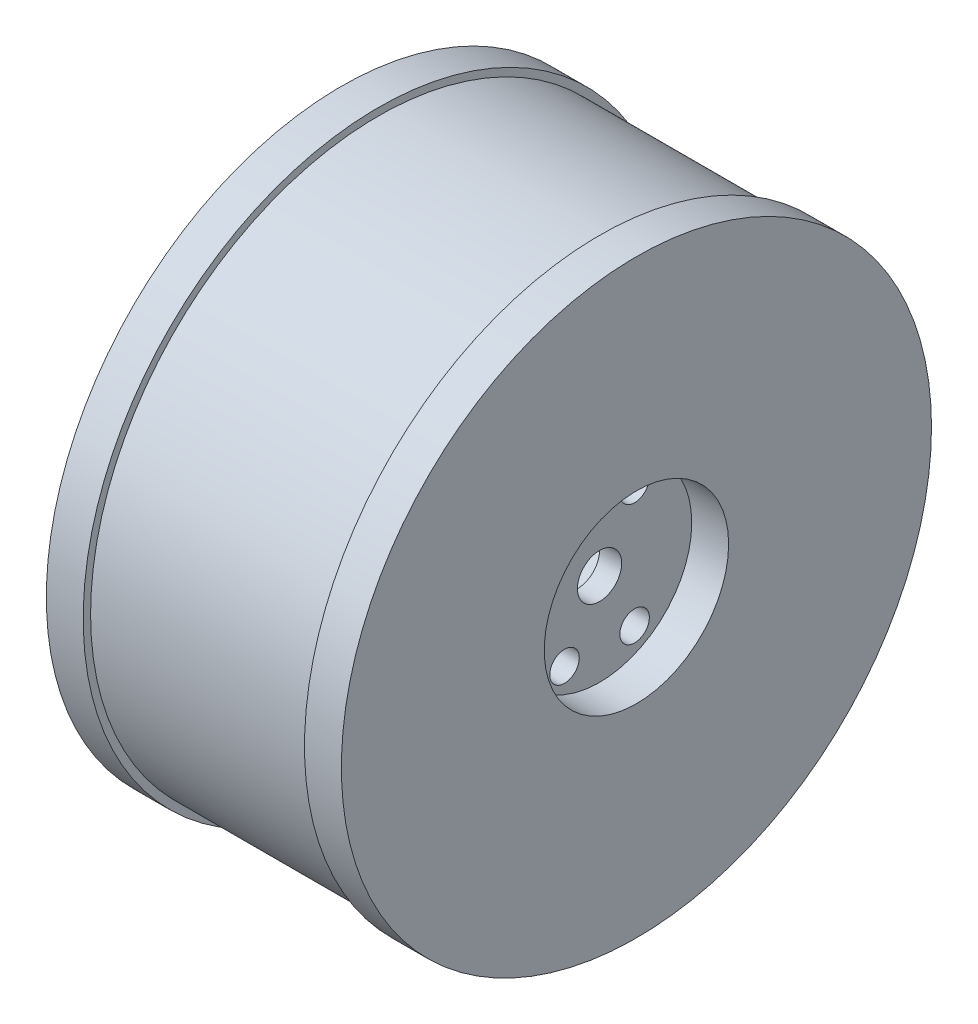
ISO-10303-21;
HEADER;
FILE_DESCRIPTION(('STEP AP214'),'2;1');
FILE_NAME('part.step','',(''),(''),'','','');
FILE_SCHEMA(('AUTOMOTIVE_DESIGN { 1 0 10303 214 1 1 1 1 }'));
ENDSEC;
DATA;
#1=APPLICATION_CONTEXT('core data for automotive mechanical design processes');
#2=APPLICATION_PROTOCOL_DEFINITION('international standard','automotive_design',2000,#1);
#3=PRODUCT_CONTEXT('',#1,'mechanical');
#4=PRODUCT('Part','Part','',(#3));
#5=PRODUCT_RELATED_PRODUCT_CATEGORY('part','',(#4));
#6=PRODUCT_DEFINITION_FORMATION('','',#4);
#7=PRODUCT_DEFINITION_CONTEXT('part definition',#1,'design');
#8=PRODUCT_DEFINITION('design','',#6,#7);
#9=PRODUCT_DEFINITION_SHAPE('','',#8);
#10=(LENGTH_UNIT() NAMED_UNIT(*) SI_UNIT(.MILLI.,.METRE.));
#11=(NAMED_UNIT(*) PLANE_ANGLE_UNIT() SI_UNIT($,.RADIAN.));
#12=(NAMED_UNIT(*) SI_UNIT($,.STERADIAN.) SOLID_ANGLE_UNIT());
#13=UNCERTAINTY_MEASURE_WITH_UNIT(LENGTH_MEASURE(1.E-05),#10,'distance_accuracy_value','');
#14=(GEOMETRIC_REPRESENTATION_CONTEXT(3) GLOBAL_UNCERTAINTY_ASSIGNED_CONTEXT((#13)) GLOBAL_UNIT_ASSIGNED_CONTEXT((#10,
#11,#12)) REPRESENTATION_CONTEXT('',''));
#15=CARTESIAN_POINT('',(0.,0.,0.));
#16=DIRECTION('',(0.,0.,1.));
#17=DIRECTION('',(1.,0.,0.));
#18=AXIS2_PLACEMENT_3D('',#15,#16,#17);
#19=CARTESIAN_POINT('',(-49.6444990272904,0.,0.));
#20=DIRECTION('',(-1.,0.,0.));
#21=DIRECTION('',(0.,0.,-1.));
#22=AXIS2_PLACEMENT_3D('',#19,#20,#21);
#23=CYLINDRICAL_SURFACE('',#22,34.);
#24=CARTESIAN_POINT('',(0.,0.,0.));
#25=DIRECTION('',(1.,0.,0.));
#26=DIRECTION('',(0.,0.,-1.));
#27=AXIS2_PLACEMENT_3D('',#24,#25,#26);
#28=CIRCLE('',#27,34.);
#29=CARTESIAN_POINT('',(0.,0.,-34.));
#30=VERTEX_POINT('',#29);
#31=EDGE_CURVE('E58',#30,#30,#28,.T.);
#32=ORIENTED_EDGE('',*,*,#31,.T.);
#33=EDGE_LOOP('',(#32));
#34=FACE_BOUND('',#33,.T.);
#35=CARTESIAN_POINT('',(-32.,0.,0.));
#36=DIRECTION('',(1.,0.,0.));
#37=DIRECTION('',(0.,0.,-1.));
#38=AXIS2_PLACEMENT_3D('',#35,#36,#37);
#39=CIRCLE('',#38,34.);
#40=CARTESIAN_POINT('',(-32.,0.,-34.));
#41=VERTEX_POINT('',#40);
#42=EDGE_CURVE('E10',#41,#41,#39,.T.);
#43=ORIENTED_EDGE('',*,*,#42,.F.);
#44=EDGE_LOOP('',(#43));
#45=FACE_BOUND('',#44,.T.);
#46=ADVANCED_FACE('F30',(#34,#45),#23,.F.);
#47=CARTESIAN_POINT('',(-32.,34.,0.));
#48=DIRECTION('',(1.,0.,0.));
#49=DIRECTION('',(0.,0.,1.));
#50=AXIS2_PLACEMENT_3D('',#47,#48,#49);
#51=PLANE('',#50);
#52=ORIENTED_EDGE('',*,*,#42,.T.);
#53=EDGE_LOOP('',(#52));
#54=FACE_BOUND('',#53,.T.);
#55=CARTESIAN_POINT('',(-32.,0.,0.));
#56=DIRECTION('',(1.,0.,0.));
#57=DIRECTION('',(0.,0.,-1.));
#58=AXIS2_PLACEMENT_3D('',#55,#56,#57);
#59=CIRCLE('',#58,40.);
#60=CARTESIAN_POINT('',(-32.,0.,-40.));
#61=VERTEX_POINT('',#60);
#62=EDGE_CURVE('E36',#61,#61,#59,.T.);
#63=ORIENTED_EDGE('',*,*,#62,.F.);
#64=EDGE_LOOP('',(#63));
#65=FACE_BOUND('',#64,.T.);
#66=ADVANCED_FACE('F126',(#54,#65),#51,.F.);
#67=CARTESIAN_POINT('',(-49.6444990272904,0.,0.));
#68=DIRECTION('',(-1.,0.,0.));
#69=DIRECTION('',(0.,0.,-1.));
#70=AXIS2_PLACEMENT_3D('',#67,#68,#69);
#71=CYLINDRICAL_SURFACE('',#70,40.);
#72=ORIENTED_EDGE('',*,*,#62,.T.);
#73=EDGE_LOOP('',(#72));
#74=FACE_BOUND('',#73,.T.);
#75=CARTESIAN_POINT('',(-27.,0.,0.));
#76=DIRECTION('',(1.,0.,0.));
#77=DIRECTION('',(0.,0.,-1.));
#78=AXIS2_PLACEMENT_3D('',#75,#76,#77);
#79=CIRCLE('',#78,40.);
#80=CARTESIAN_POINT('',(-27.,0.,-39.9999999999999));
#81=VERTEX_POINT('',#80);
#82=EDGE_CURVE('E40',#81,#81,#79,.T.);
#83=ORIENTED_EDGE('',*,*,#82,.F.);
#84=EDGE_LOOP('',(#83));
#85=FACE_BOUND('',#84,.T.);
#86=ADVANCED_FACE('F130',(#74,#85),#71,.T.);
#87=CARTESIAN_POINT('',(-27.,40.,0.));
#88=DIRECTION('',(-1.,0.,0.));
#89=DIRECTION('',(0.,0.,-1.));
#90=AXIS2_PLACEMENT_3D('',#87,#88,#89);
#91=PLANE('',#90);
#92=ORIENTED_EDGE('',*,*,#82,.T.);
#93=EDGE_LOOP('',(#92));
#94=FACE_BOUND('',#93,.T.);
#95=CARTESIAN_POINT('',(-27.,0.,0.));
#96=DIRECTION('',(1.,0.,0.));
#97=DIRECTION('',(0.,0.,-1.));
#98=AXIS2_PLACEMENT_3D('',#95,#96,#97);
#99=CIRCLE('',#98,39.);
#100=CARTESIAN_POINT('',(-27.,0.,-38.9999999999999));
#101=VERTEX_POINT('',#100);
#102=EDGE_CURVE('E44',#101,#101,#99,.T.);
#103=ORIENTED_EDGE('',*,*,#102,.F.);
#104=EDGE_LOOP('',(#103));
#105=FACE_BOUND('',#104,.T.);
#106=ADVANCED_FACE('F134',(#94,#105),#91,.F.);
#107=CARTESIAN_POINT('',(-49.6444990272904,0.,0.));
#108=DIRECTION('',(-1.,0.,0.));
#109=DIRECTION('',(0.,0.,-1.));
#110=AXIS2_PLACEMENT_3D('',#107,#108,#109);
#111=CYLINDRICAL_SURFACE('',#110,39.);
#112=ORIENTED_EDGE('',*,*,#102,.T.);
#113=EDGE_LOOP('',(#112));
#114=FACE_BOUND('',#113,.T.);
#115=CARTESIAN_POINT('',(3.,0.,0.));
#116=DIRECTION('',(1.,0.,0.));
#117=DIRECTION('',(0.,0.,-1.));
#118=AXIS2_PLACEMENT_3D('',#115,#116,#117);
#119=CIRCLE('',#118,39.);
#120=CARTESIAN_POINT('',(3.,0.,-39.));
#121=VERTEX_POINT('',#120);
#122=EDGE_CURVE('E49',#121,#121,#119,.T.);
#123=ORIENTED_EDGE('',*,*,#122,.F.);
#124=EDGE_LOOP('',(#123));
#125=FACE_BOUND('',#124,.T.);
#126=ADVANCED_FACE('F140',(#114,#125),#111,.T.);
#127=CARTESIAN_POINT('',(3.,39.,0.));
#128=DIRECTION('',(1.,0.,0.));
#129=DIRECTION('',(0.,0.,1.));
#130=AXIS2_PLACEMENT_3D('',#127,#128,#129);
#131=PLANE('',#130);
#132=ORIENTED_EDGE('',*,*,#122,.T.);
#133=EDGE_LOOP('',(#132));
#134=FACE_BOUND('',#133,.T.);
#135=CARTESIAN_POINT('',(3.,0.,0.));
#136=DIRECTION('',(1.,0.,0.));
#137=DIRECTION('',(0.,0.,-1.));
#138=AXIS2_PLACEMENT_3D('',#135,#136,#137);
#139=CIRCLE('',#138,40.);
#140=CARTESIAN_POINT('',(3.,0.,-40.));
#141=VERTEX_POINT('',#140);
#142=EDGE_CURVE('E52',#141,#141,#139,.T.);
#143=ORIENTED_EDGE('',*,*,#142,.F.);
#144=EDGE_LOOP('',(#143));
#145=FACE_BOUND('',#144,.T.);
#146=ADVANCED_FACE('F144',(#134,#145),#131,.F.);
#147=CARTESIAN_POINT('',(-49.6444990272904,0.,0.));
#148=DIRECTION('',(-1.,0.,0.));
#149=DIRECTION('',(0.,0.,-1.));
#150=AXIS2_PLACEMENT_3D('',#147,#148,#149);
#151=CYLINDRICAL_SURFACE('',#150,40.);
#152=ORIENTED_EDGE('',*,*,#142,.T.);
#153=EDGE_LOOP('',(#152));
#154=FACE_BOUND('',#153,.T.);
#155=CARTESIAN_POINT('',(8.,0.,0.));
#156=DIRECTION('',(1.,0.,0.));
#157=DIRECTION('',(0.,0.,-1.));
#158=AXIS2_PLACEMENT_3D('',#155,#156,#157);
#159=CIRCLE('',#158,40.);
#160=CARTESIAN_POINT('',(8.,0.,-40.));
#161=VERTEX_POINT('',#160);
#162=EDGE_CURVE('E55',#161,#161,#159,.T.);
#163=ORIENTED_EDGE('',*,*,#162,.F.);
#164=EDGE_LOOP('',(#163));
#165=FACE_BOUND('',#164,.T.);
#166=ADVANCED_FACE('F148',(#154,#165),#151,.T.);
#167=CARTESIAN_POINT('',(8.,40.,0.));
#168=DIRECTION('',(-1.,0.,0.));
#169=DIRECTION('',(0.,0.,-1.));
#170=AXIS2_PLACEMENT_3D('',#167,#168,#169);
#171=PLANE('',#170);
#172=CARTESIAN_POINT('',(8.,0.,0.));
#173=DIRECTION('',(1.,0.,0.));
#174=DIRECTION('',(0.,0.,-1.));
#175=AXIS2_PLACEMENT_3D('',#172,#173,#174);
#176=CIRCLE('',#175,12.5);
#177=CARTESIAN_POINT('',(8.,0.,-12.5));
#178=VERTEX_POINT('',#177);
#179=EDGE_CURVE('E61',#178,#178,#176,.T.);
#180=ORIENTED_EDGE('',*,*,#179,.F.);
#181=EDGE_LOOP('',(#180));
#182=FACE_BOUND('',#181,.T.);
#183=ORIENTED_EDGE('',*,*,#162,.T.);
#184=EDGE_LOOP('',(#183));
#185=FACE_BOUND('',#184,.T.);
#186=ADVANCED_FACE('F112',(#182,#185),#171,.F.);
#187=CARTESIAN_POINT('',(0.,34.,0.));
#188=DIRECTION('',(1.,0.,0.));
#189=DIRECTION('',(0.,0.,1.));
#190=AXIS2_PLACEMENT_3D('',#187,#188,#189);
#191=PLANE('',#190);
#192=CARTESIAN_POINT('',(0.,0.,0.));
#193=DIRECTION('',(-1.,0.,0.));
#194=DIRECTION('',(0.,0.,1.));
#195=AXIS2_PLACEMENT_3D('',#192,#193,#194);
#196=CIRCLE('',#195,3.);
#197=CARTESIAN_POINT('',(0.,0.,3.));
#198=VERTEX_POINT('',#197);
#199=EDGE_CURVE('E91',#198,#198,#196,.T.);
#200=ORIENTED_EDGE('',*,*,#199,.F.);
#201=EDGE_LOOP('',(#200));
#202=FACE_BOUND('',#201,.T.);
#203=CARTESIAN_POINT('',(0.,8.22724133595216,-4.75));
#204=DIRECTION('',(-1.,0.,0.));
#205=DIRECTION('',(0.,0.,1.));
#206=AXIS2_PLACEMENT_3D('',#203,#204,#205);
#207=CIRCLE('',#206,2.);
#208=CARTESIAN_POINT('',(0.,8.22724133595216,-2.75));
#209=VERTEX_POINT('',#208);
#210=EDGE_CURVE('E67',#209,#209,#207,.T.);
#211=ORIENTED_EDGE('',*,*,#210,.F.);
#212=EDGE_LOOP('',(#211));
#213=FACE_BOUND('',#212,.T.);
#214=CARTESIAN_POINT('',(0.,-8.22724133595216,4.75));
#215=DIRECTION('',(-1.,0.,0.));
#216=DIRECTION('',(0.,0.,1.));
#217=AXIS2_PLACEMENT_3D('',#214,#215,#216);
#218=CIRCLE('',#217,2.);
#219=CARTESIAN_POINT('',(0.,-8.22724133595216,6.75));
#220=VERTEX_POINT('',#219);
#221=EDGE_CURVE('E70',#220,#220,#218,.T.);
#222=ORIENTED_EDGE('',*,*,#221,.F.);
#223=EDGE_LOOP('',(#222));
#224=FACE_BOUND('',#223,.T.);
#225=CARTESIAN_POINT('',(0.,-8.22724133595215,-4.75));
#226=DIRECTION('',(-1.,0.,0.));
#227=DIRECTION('',(0.,0.,1.));
#228=AXIS2_PLACEMENT_3D('',#225,#226,#227);
#229=CIRCLE('',#228,2.);
#230=CARTESIAN_POINT('',(0.,-8.22724133595215,-2.75));
#231=VERTEX_POINT('',#230);
#232=EDGE_CURVE('E73',#231,#231,#229,.T.);
#233=ORIENTED_EDGE('',*,*,#232,.F.);
#234=EDGE_LOOP('',(#233));
#235=FACE_BOUND('',#234,.T.);
#236=CARTESIAN_POINT('',(0.,8.22724133595223,4.75));
#237=DIRECTION('',(-1.,0.,0.));
#238=DIRECTION('',(0.,0.,1.));
#239=AXIS2_PLACEMENT_3D('',#236,#237,#238);
#240=CIRCLE('',#239,2.);
#241=CARTESIAN_POINT('',(0.,8.22724133595223,6.75));
#242=VERTEX_POINT('',#241);
#243=EDGE_CURVE('E76',#242,#242,#240,.T.);
#244=ORIENTED_EDGE('',*,*,#243,.F.);
#245=EDGE_LOOP('',(#244));
#246=FACE_BOUND('',#245,.T.);
#247=ORIENTED_EDGE('',*,*,#31,.F.);
#248=EDGE_LOOP('',(#247));
#249=FACE_BOUND('',#248,.T.);
#250=ADVANCED_FACE('F108',(#202,#213,#224,#235,#246,#249),#191,.F.);
#251=CARTESIAN_POINT('',(0.,0.,0.));
#252=DIRECTION('',(-1.,0.,0.));
#253=DIRECTION('',(0.,0.,-1.));
#254=AXIS2_PLACEMENT_3D('',#251,#252,#253);
#255=CYLINDRICAL_SURFACE('',#254,12.5);
#256=CARTESIAN_POINT('',(3.,0.,0.));
#257=DIRECTION('',(1.,0.,0.));
#258=DIRECTION('',(0.,0.,-1.));
#259=AXIS2_PLACEMENT_3D('',#256,#257,#258);
#260=CIRCLE('',#259,12.5);
#261=CARTESIAN_POINT('',(3.,0.,-12.5));
#262=VERTEX_POINT('',#261);
#263=EDGE_CURVE('E64',#262,#262,#260,.T.);
#264=ORIENTED_EDGE('',*,*,#263,.F.);
#265=EDGE_LOOP('',(#264));
#266=FACE_BOUND('',#265,.T.);
#267=ORIENTED_EDGE('',*,*,#179,.T.);
#268=EDGE_LOOP('',(#267));
#269=FACE_BOUND('',#268,.T.);
#270=ADVANCED_FACE('F111',(#266,#269),#255,.F.);
#271=CARTESIAN_POINT('',(3.,12.5,0.));
#272=DIRECTION('',(1.,0.,0.));
#273=DIRECTION('',(0.,0.,1.));
#274=AXIS2_PLACEMENT_3D('',#271,#272,#273);
#275=PLANE('',#274);
#276=CARTESIAN_POINT('',(3.,0.,0.));
#277=DIRECTION('',(-1.,0.,0.));
#278=DIRECTION('',(0.,0.,1.));
#279=AXIS2_PLACEMENT_3D('',#276,#277,#278);
#280=CIRCLE('',#279,3.);
#281=CARTESIAN_POINT('',(3.,0.,3.));
#282=VERTEX_POINT('',#281);
#283=EDGE_CURVE('E94',#282,#282,#280,.T.);
#284=ORIENTED_EDGE('',*,*,#283,.T.);
#285=EDGE_LOOP('',(#284));
#286=FACE_BOUND('',#285,.T.);
#287=CARTESIAN_POINT('',(3.,8.22724133595223,-4.75));
#288=DIRECTION('',(-1.,0.,0.));
#289=DIRECTION('',(0.,0.,-1.));
#290=AXIS2_PLACEMENT_3D('',#287,#288,#289);
#291=CIRCLE('',#290,2.);
#292=CARTESIAN_POINT('',(3.,8.22724133595223,-6.75));
#293=VERTEX_POINT('',#292);
#294=EDGE_CURVE('E82',#293,#293,#291,.T.);
#295=ORIENTED_EDGE('',*,*,#294,.T.);
#296=EDGE_LOOP('',(#295));
#297=FACE_BOUND('',#296,.T.);
#298=CARTESIAN_POINT('',(3.,-8.22724133595216,4.75000000000001));
#299=DIRECTION('',(-1.,0.,0.));
#300=DIRECTION('',(0.,0.,-1.));
#301=AXIS2_PLACEMENT_3D('',#298,#299,#300);
#302=CIRCLE('',#301,2.);
#303=CARTESIAN_POINT('',(3.,-8.22724133595216,2.75000000000001));
#304=VERTEX_POINT('',#303);
#305=EDGE_CURVE('E83',#304,#304,#302,.T.);
#306=ORIENTED_EDGE('',*,*,#305,.T.);
#307=EDGE_LOOP('',(#306));
#308=FACE_BOUND('',#307,.T.);
#309=CARTESIAN_POINT('',(3.,-8.22724133595216,-4.75));
#310=DIRECTION('',(-1.,0.,0.));
#311=DIRECTION('',(0.,0.,1.));
#312=AXIS2_PLACEMENT_3D('',#309,#310,#311);
#313=CIRCLE('',#312,2.);
#314=CARTESIAN_POINT('',(3.,-8.22724133595216,-2.75));
#315=VERTEX_POINT('',#314);
#316=EDGE_CURVE('E86',#315,#315,#313,.T.);
#317=ORIENTED_EDGE('',*,*,#316,.T.);
#318=EDGE_LOOP('',(#317));
#319=FACE_BOUND('',#318,.T.);
#320=CARTESIAN_POINT('',(3.,8.22724133595223,4.75000000000001));
#321=DIRECTION('',(-1.,0.,0.));
#322=DIRECTION('',(0.,0.,1.));
#323=AXIS2_PLACEMENT_3D('',#320,#321,#322);
#324=CIRCLE('',#323,2.);
#325=CARTESIAN_POINT('',(3.,8.22724133595223,6.75000000000001));
#326=VERTEX_POINT('',#325);
#327=EDGE_CURVE('E79',#326,#326,#324,.T.);
#328=ORIENTED_EDGE('',*,*,#327,.T.);
#329=EDGE_LOOP('',(#328));
#330=FACE_BOUND('',#329,.T.);
#331=ORIENTED_EDGE('',*,*,#263,.T.);
#332=EDGE_LOOP('',(#331));
#333=FACE_BOUND('',#332,.T.);
#334=ADVANCED_FACE('F98',(#286,#297,#308,#319,#330,#333),#275,.T.);
#335=CARTESIAN_POINT('',(-32.,8.22724133595223,4.75000000000001));
#336=DIRECTION('',(1.,0.,0.));
#337=DIRECTION('',(0.,0.,1.));
#338=AXIS2_PLACEMENT_3D('',#335,#336,#337);
#339=CYLINDRICAL_SURFACE('',#338,2.);
#340=ORIENTED_EDGE('',*,*,#327,.F.);
#341=EDGE_LOOP('',(#340));
#342=FACE_BOUND('',#341,.T.);
#343=ORIENTED_EDGE('',*,*,#243,.T.);
#344=EDGE_LOOP('',(#343));
#345=FACE_BOUND('',#344,.T.);
#346=ADVANCED_FACE('F161',(#342,#345),#339,.F.);
#347=CARTESIAN_POINT('',(-32.,-8.22724133595216,-4.75));
#348=DIRECTION('',(1.,0.,0.));
#349=DIRECTION('',(0.,0.,1.));
#350=AXIS2_PLACEMENT_3D('',#347,#348,#349);
#351=CYLINDRICAL_SURFACE('',#350,2.);
#352=ORIENTED_EDGE('',*,*,#316,.F.);
#353=EDGE_LOOP('',(#352));
#354=FACE_BOUND('',#353,.T.);
#355=ORIENTED_EDGE('',*,*,#232,.T.);
#356=EDGE_LOOP('',(#355));
#357=FACE_BOUND('',#356,.T.);
#358=ADVANCED_FACE('F164',(#354,#357),#351,.F.);
#359=CARTESIAN_POINT('',(-32.,-8.22724133595216,4.75000000000001));
#360=DIRECTION('',(1.,0.,0.));
#361=DIRECTION('',(0.,0.,1.));
#362=AXIS2_PLACEMENT_3D('',#359,#360,#361);
#363=CYLINDRICAL_SURFACE('',#362,2.);
#364=ORIENTED_EDGE('',*,*,#305,.F.);
#365=EDGE_LOOP('',(#364));
#366=FACE_BOUND('',#365,.T.);
#367=ORIENTED_EDGE('',*,*,#221,.T.);
#368=EDGE_LOOP('',(#367));
#369=FACE_BOUND('',#368,.T.);
#370=ADVANCED_FACE('F166',(#366,#369),#363,.F.);
#371=CARTESIAN_POINT('',(-32.,8.22724133595223,-4.75));
#372=DIRECTION('',(1.,0.,0.));
#373=DIRECTION('',(0.,0.,1.));
#374=AXIS2_PLACEMENT_3D('',#371,#372,#373);
#375=CYLINDRICAL_SURFACE('',#374,2.);
#376=ORIENTED_EDGE('',*,*,#294,.F.);
#377=EDGE_LOOP('',(#376));
#378=FACE_BOUND('',#377,.T.);
#379=ORIENTED_EDGE('',*,*,#210,.T.);
#380=EDGE_LOOP('',(#379));
#381=FACE_BOUND('',#380,.T.);
#382=ADVANCED_FACE('F104',(#378,#381),#375,.F.);
#383=CARTESIAN_POINT('',(-32.,0.,0.));
#384=DIRECTION('',(1.,0.,0.));
#385=DIRECTION('',(0.,0.,1.));
#386=AXIS2_PLACEMENT_3D('',#383,#384,#385);
#387=CYLINDRICAL_SURFACE('',#386,3.);
#388=ORIENTED_EDGE('',*,*,#283,.F.);
#389=EDGE_LOOP('',(#388));
#390=FACE_BOUND('',#389,.T.);
#391=ORIENTED_EDGE('',*,*,#199,.T.);
#392=EDGE_LOOP('',(#391));
#393=FACE_BOUND('',#392,.T.);
#394=ADVANCED_FACE('F101',(#390,#393),#387,.F.);
#395=CLOSED_SHELL('',(#46,#66,#86,#106,#126,#146,#166,#186,#250,#270,#334,#346,#358,#370,#382,#394));
#396=MANIFOLD_SOLID_BREP('B2',#395);
#397=ADVANCED_BREP_SHAPE_REPRESENTATION('',(#18,#396),#14);
#398=SHAPE_DEFINITION_REPRESENTATION(#9,#397);
ENDSEC;
END-ISO-10303-21;
